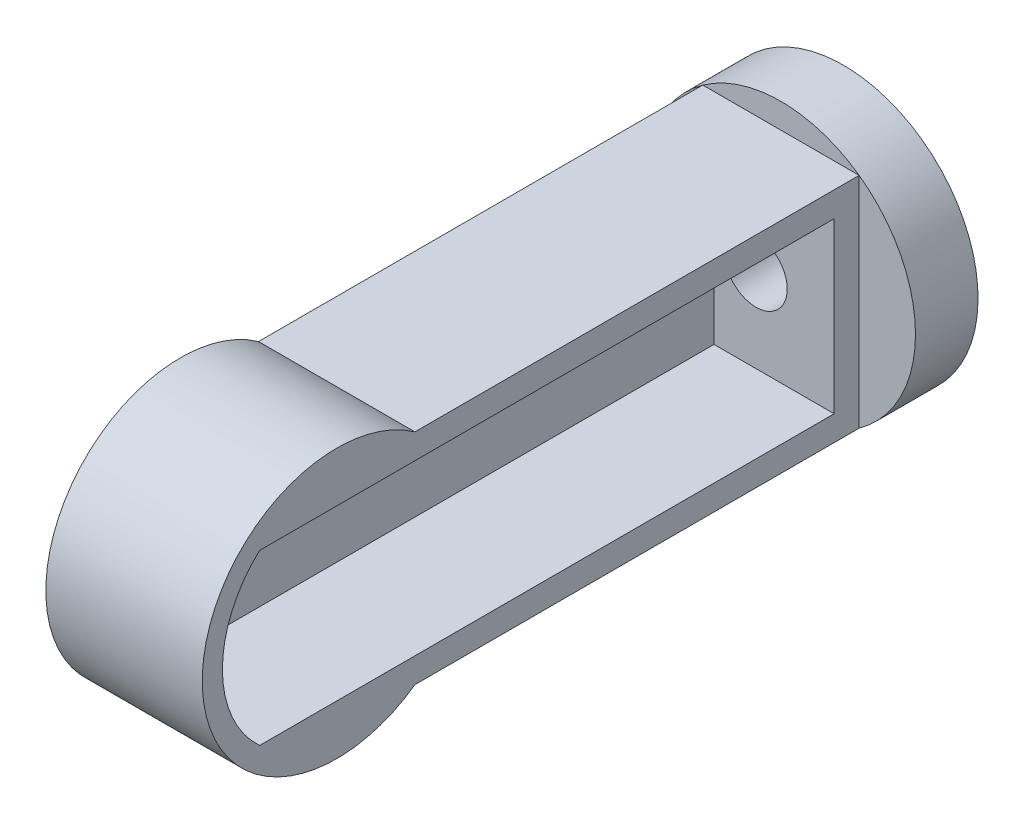
ISO-10303-21;
HEADER;
FILE_DESCRIPTION(('STEP AP214'),'2;1');
FILE_NAME('part.step','',(''),(''),'','','');
FILE_SCHEMA(('AUTOMOTIVE_DESIGN { 1 0 10303 214 1 1 1 1 }'));
ENDSEC;
DATA;
#1=APPLICATION_CONTEXT('core data for automotive mechanical design processes');
#2=APPLICATION_PROTOCOL_DEFINITION('international standard','automotive_design',2000,#1);
#3=PRODUCT_CONTEXT('',#1,'mechanical');
#4=PRODUCT('Part','Part','',(#3));
#5=PRODUCT_RELATED_PRODUCT_CATEGORY('part','',(#4));
#6=PRODUCT_DEFINITION_FORMATION('','',#4);
#7=PRODUCT_DEFINITION_CONTEXT('part definition',#1,'design');
#8=PRODUCT_DEFINITION('design','',#6,#7);
#9=PRODUCT_DEFINITION_SHAPE('','',#8);
#10=(LENGTH_UNIT() NAMED_UNIT(*) SI_UNIT(.MILLI.,.METRE.));
#11=(NAMED_UNIT(*) PLANE_ANGLE_UNIT() SI_UNIT($,.RADIAN.));
#12=(NAMED_UNIT(*) SI_UNIT($,.STERADIAN.) SOLID_ANGLE_UNIT());
#13=UNCERTAINTY_MEASURE_WITH_UNIT(LENGTH_MEASURE(1.E-05),#10,'distance_accuracy_value','');
#14=(GEOMETRIC_REPRESENTATION_CONTEXT(3) GLOBAL_UNCERTAINTY_ASSIGNED_CONTEXT((#13)) GLOBAL_UNIT_ASSIGNED_CONTEXT((#10,
#11,#12)) REPRESENTATION_CONTEXT('',''));
#15=CARTESIAN_POINT('',(0.,0.,0.));
#16=DIRECTION('',(0.,0.,1.));
#17=DIRECTION('',(1.,0.,0.));
#18=AXIS2_PLACEMENT_3D('',#15,#16,#17);
#19=CARTESIAN_POINT('',(12.5,0.,-59.4378440882945));
#20=DIRECTION('',(0.,0.,-1.));
#21=DIRECTION('',(-1.,0.,0.));
#22=AXIS2_PLACEMENT_3D('',#19,#20,#21);
#23=PLANE('',#22);
#24=CARTESIAN_POINT('',(0.,0.,-59.4378440882945));
#25=DIRECTION('',(0.,0.,-1.));
#26=DIRECTION('',(-1.,0.,0.));
#27=AXIS2_PLACEMENT_3D('',#24,#25,#26);
#28=CIRCLE('',#27,21.5);
#29=CARTESIAN_POINT('',(-12.5,17.4928556845359,-59.4378440882945));
#30=VERTEX_POINT('',#29);
#31=CARTESIAN_POINT('',(-12.4899959967968,17.5,-59.4378440882945));
#32=VERTEX_POINT('',#31);
#33=EDGE_CURVE('E161',#30,#32,#28,.T.);
#34=ORIENTED_EDGE('',*,*,#33,.F.);
#35=DIRECTION('',(0.,-1.,0.));
#36=VECTOR('',#35,1.);
#37=CARTESIAN_POINT('',(-12.5,0.,-59.4378440882945));
#38=LINE('',#37,#36);
#39=CARTESIAN_POINT('',(-12.5,17.5,-59.4378440882945));
#40=VERTEX_POINT('',#39);
#41=EDGE_CURVE('E144',#40,#30,#38,.T.);
#42=ORIENTED_EDGE('',*,*,#41,.F.);
#43=DIRECTION('',(-1.,0.,0.));
#44=VECTOR('',#43,1.);
#45=CARTESIAN_POINT('',(12.5,17.5,-59.4378440882945));
#46=LINE('',#45,#44);
#47=EDGE_CURVE('E283',#32,#40,#46,.T.);
#48=ORIENTED_EDGE('',*,*,#47,.F.);
#49=EDGE_LOOP('',(#34,#42,#48));
#50=FACE_BOUND('',#49,.T.);
#51=ADVANCED_FACE('F41',(#50),#23,.T.);
#52=CARTESIAN_POINT('',(12.4899959967968,17.5,-59.4378440882945));
#53=VERTEX_POINT('',#52);
#54=CARTESIAN_POINT('',(12.5,17.4928556845359,-59.4378440882945));
#55=VERTEX_POINT('',#54);
#56=EDGE_CURVE('E11',#53,#55,#28,.T.);
#57=ORIENTED_EDGE('',*,*,#56,.F.);
#58=CARTESIAN_POINT('',(12.5,17.5,-59.4378440882945));
#59=VERTEX_POINT('',#58);
#60=EDGE_CURVE('E284',#59,#53,#46,.T.);
#61=ORIENTED_EDGE('',*,*,#60,.F.);
#62=DIRECTION('',(0.,-1.,0.));
#63=VECTOR('',#62,1.);
#64=CARTESIAN_POINT('',(12.5,0.,-59.4378440882945));
#65=LINE('',#64,#63);
#66=EDGE_CURVE('E253',#59,#55,#65,.T.);
#67=ORIENTED_EDGE('',*,*,#66,.T.);
#68=EDGE_LOOP('',(#57,#61,#67));
#69=FACE_BOUND('',#68,.T.);
#70=ADVANCED_FACE('F215',(#69),#23,.T.);
#71=CARTESIAN_POINT('',(12.5,-17.4928556845359,-59.4378440882945));
#72=VERTEX_POINT('',#71);
#73=CARTESIAN_POINT('',(12.4899959967968,-17.5,-59.4378440882945));
#74=VERTEX_POINT('',#73);
#75=EDGE_CURVE('E51',#72,#74,#28,.T.);
#76=ORIENTED_EDGE('',*,*,#75,.F.);
#77=CARTESIAN_POINT('',(12.5,-17.5,-59.4378440882945));
#78=VERTEX_POINT('',#77);
#79=EDGE_CURVE('E242',#72,#78,#65,.T.);
#80=ORIENTED_EDGE('',*,*,#79,.T.);
#81=DIRECTION('',(-1.,0.,0.));
#82=VECTOR('',#81,1.);
#83=CARTESIAN_POINT('',(12.5,-17.5,-59.4378440882945));
#84=LINE('',#83,#82);
#85=EDGE_CURVE('E170',#78,#74,#84,.T.);
#86=ORIENTED_EDGE('',*,*,#85,.T.);
#87=EDGE_LOOP('',(#76,#80,#86));
#88=FACE_BOUND('',#87,.T.);
#89=ADVANCED_FACE('F221',(#88),#23,.T.);
#90=CARTESIAN_POINT('',(12.5,0.,24.0621559117055));
#91=DIRECTION('',(-1.,0.,0.));
#92=DIRECTION('',(0.,0.,1.));
#93=AXIS2_PLACEMENT_3D('',#90,#91,#92);
#94=CYLINDRICAL_SURFACE('',#93,5.);
#95=CARTESIAN_POINT('',(-12.5,0.,24.0621559117055));
#96=DIRECTION('',(1.,0.,0.));
#97=DIRECTION('',(0.,0.,-1.));
#98=AXIS2_PLACEMENT_3D('',#95,#96,#97);
#99=CIRCLE('',#98,5.);
#100=CARTESIAN_POINT('',(-12.5,0.,19.0621559117055));
#101=VERTEX_POINT('',#100);
#102=EDGE_CURVE('E265',#101,#101,#99,.T.);
#103=ORIENTED_EDGE('',*,*,#102,.F.);
#104=EDGE_LOOP('',(#103));
#105=FACE_BOUND('',#104,.T.);
#106=CARTESIAN_POINT('',(-6.7,0.,24.0621559117055));
#107=DIRECTION('',(1.,0.,0.));
#108=DIRECTION('',(0.,0.,-1.));
#109=AXIS2_PLACEMENT_3D('',#106,#107,#108);
#110=CIRCLE('',#109,5.);
#111=CARTESIAN_POINT('',(-6.7,0.,19.0621559117055));
#112=VERTEX_POINT('',#111);
#113=EDGE_CURVE('E308',#112,#112,#110,.F.);
#114=ORIENTED_EDGE('',*,*,#113,.F.);
#115=EDGE_LOOP('',(#114));
#116=FACE_BOUND('',#115,.T.);
#117=ADVANCED_FACE('F43',(#105,#116),#94,.F.);
#118=CARTESIAN_POINT('',(12.5,0.,24.0621559117055));
#119=DIRECTION('',(-1.,0.,0.));
#120=DIRECTION('',(0.,0.,1.));
#121=AXIS2_PLACEMENT_3D('',#118,#119,#120);
#122=CYLINDRICAL_SURFACE('',#121,21.5);
#123=CARTESIAN_POINT('',(-12.5,0.,24.0621559117055));
#124=DIRECTION('',(1.,0.,0.));
#125=DIRECTION('',(0.,0.,-1.));
#126=AXIS2_PLACEMENT_3D('',#123,#124,#125);
#127=CIRCLE('',#126,21.5);
#128=CARTESIAN_POINT('',(-12.5,17.5,11.5721599149088));
#129=VERTEX_POINT('',#128);
#130=CARTESIAN_POINT('',(-12.5,-17.5,11.5721599149088));
#131=VERTEX_POINT('',#130);
#132=EDGE_CURVE('E269',#129,#131,#127,.T.);
#133=ORIENTED_EDGE('',*,*,#132,.T.);
#134=DIRECTION('',(-1.,0.,0.));
#135=VECTOR('',#134,1.);
#136=CARTESIAN_POINT('',(12.5,-17.5,11.5721599149088));
#137=LINE('',#136,#135);
#138=CARTESIAN_POINT('',(12.5,-17.5,11.5721599149088));
#139=VERTEX_POINT('',#138);
#140=EDGE_CURVE('E45',#139,#131,#137,.T.);
#141=ORIENTED_EDGE('',*,*,#140,.F.);
#142=CARTESIAN_POINT('',(12.5,0.,24.0621559117055));
#143=DIRECTION('',(1.,0.,0.));
#144=DIRECTION('',(0.,0.,-1.));
#145=AXIS2_PLACEMENT_3D('',#142,#143,#144);
#146=CIRCLE('',#145,21.5);
#147=CARTESIAN_POINT('',(12.5,17.5,11.5721599149088));
#148=VERTEX_POINT('',#147);
#149=EDGE_CURVE('E280',#148,#139,#146,.T.);
#150=ORIENTED_EDGE('',*,*,#149,.F.);
#151=DIRECTION('',(-1.,0.,0.));
#152=VECTOR('',#151,1.);
#153=CARTESIAN_POINT('',(12.5,17.5,11.5721599149088));
#154=LINE('',#153,#152);
#155=EDGE_CURVE('E264',#148,#129,#154,.T.);
#156=ORIENTED_EDGE('',*,*,#155,.T.);
#157=EDGE_LOOP('',(#133,#141,#150,#156));
#158=FACE_BOUND('',#157,.T.);
#159=ADVANCED_FACE('F234',(#158),#122,.T.);
#160=CARTESIAN_POINT('',(12.5,-17.5,0.));
#161=DIRECTION('',(0.,1.,0.));
#162=DIRECTION('',(0.,0.,1.));
#163=AXIS2_PLACEMENT_3D('',#160,#161,#162);
#164=PLANE('',#163);
#165=DIRECTION('',(0.,0.,-1.));
#166=VECTOR('',#165,1.);
#167=CARTESIAN_POINT('',(-12.5,-17.5,0.));
#168=LINE('',#167,#166);
#169=CARTESIAN_POINT('',(-12.5,-17.5,-59.4378440882945));
#170=VERTEX_POINT('',#169);
#171=EDGE_CURVE('E153',#131,#170,#168,.T.);
#172=ORIENTED_EDGE('',*,*,#171,.T.);
#173=CARTESIAN_POINT('',(-12.4899959967968,-17.5,-59.4378440882945));
#174=VERTEX_POINT('',#173);
#175=EDGE_CURVE('E151',#174,#170,#84,.T.);
#176=ORIENTED_EDGE('',*,*,#175,.F.);
#177=EDGE_CURVE('E67',#74,#174,#84,.T.);
#178=ORIENTED_EDGE('',*,*,#177,.F.);
#179=ORIENTED_EDGE('',*,*,#85,.F.);
#180=DIRECTION('',(0.,0.,-1.));
#181=VECTOR('',#180,1.);
#182=CARTESIAN_POINT('',(12.5,-17.5,0.));
#183=LINE('',#182,#181);
#184=EDGE_CURVE('E250',#139,#78,#183,.T.);
#185=ORIENTED_EDGE('',*,*,#184,.F.);
#186=ORIENTED_EDGE('',*,*,#140,.T.);
#187=EDGE_LOOP('',(#172,#176,#178,#179,#185,#186));
#188=FACE_BOUND('',#187,.T.);
#189=ADVANCED_FACE('F227',(#188),#164,.F.);
#190=CARTESIAN_POINT('',(-12.5,-17.4928556845359,-59.4378440882945));
#191=VERTEX_POINT('',#190);
#192=EDGE_CURVE('E60',#174,#191,#28,.T.);
#193=ORIENTED_EDGE('',*,*,#192,.F.);
#194=ORIENTED_EDGE('',*,*,#175,.T.);
#195=EDGE_CURVE('E140',#191,#170,#38,.T.);
#196=ORIENTED_EDGE('',*,*,#195,.F.);
#197=EDGE_LOOP('',(#193,#194,#196));
#198=FACE_BOUND('',#197,.T.);
#199=ADVANCED_FACE('F150',(#198),#23,.T.);
#200=CARTESIAN_POINT('',(12.5,17.5,0.));
#201=DIRECTION('',(0.,1.,0.));
#202=DIRECTION('',(0.,0.,1.));
#203=AXIS2_PLACEMENT_3D('',#200,#201,#202);
#204=PLANE('',#203);
#205=DIRECTION('',(0.,0.,-1.));
#206=VECTOR('',#205,1.);
#207=CARTESIAN_POINT('',(-12.5,17.5,0.));
#208=LINE('',#207,#206);
#209=EDGE_CURVE('E277',#129,#40,#208,.T.);
#210=ORIENTED_EDGE('',*,*,#209,.F.);
#211=ORIENTED_EDGE('',*,*,#155,.F.);
#212=DIRECTION('',(0.,0.,-1.));
#213=VECTOR('',#212,1.);
#214=CARTESIAN_POINT('',(12.5,17.5,0.));
#215=LINE('',#214,#213);
#216=EDGE_CURVE('E257',#148,#59,#215,.T.);
#217=ORIENTED_EDGE('',*,*,#216,.T.);
#218=ORIENTED_EDGE('',*,*,#60,.T.);
#219=EDGE_CURVE('E287',#53,#32,#46,.T.);
#220=ORIENTED_EDGE('',*,*,#219,.T.);
#221=ORIENTED_EDGE('',*,*,#47,.T.);
#222=EDGE_LOOP('',(#210,#211,#217,#218,#220,#221));
#223=FACE_BOUND('',#222,.T.);
#224=ADVANCED_FACE('F226',(#223),#204,.T.);
#225=CARTESIAN_POINT('',(12.5,0.,0.));
#226=DIRECTION('',(1.,0.,0.));
#227=DIRECTION('',(0.,0.,-1.));
#228=AXIS2_PLACEMENT_3D('',#225,#226,#227);
#229=PLANE('',#228);
#230=DIRECTION('',(0.,0.,1.));
#231=VECTOR('',#230,1.);
#232=CARTESIAN_POINT('',(12.5,13.5,0.));
#233=LINE('',#232,#231);
#234=CARTESIAN_POINT('',(12.5,13.5,-55.4378440882945));
#235=VERTEX_POINT('',#234);
#236=CARTESIAN_POINT('',(12.5,13.5,36.3845443586126));
#237=VERTEX_POINT('',#236);
#238=EDGE_CURVE('E179',#235,#237,#233,.T.);
#239=ORIENTED_EDGE('',*,*,#238,.F.);
#240=DIRECTION('',(0.,-1.,0.));
#241=VECTOR('',#240,1.);
#242=CARTESIAN_POINT('',(12.5,0.,-55.4378440882945));
#243=LINE('',#242,#241);
#244=CARTESIAN_POINT('',(12.5,-13.5,-55.4378440882945));
#245=VERTEX_POINT('',#244);
#246=EDGE_CURVE('E316',#235,#245,#243,.T.);
#247=ORIENTED_EDGE('',*,*,#246,.T.);
#248=DIRECTION('',(0.,0.,1.));
#249=VECTOR('',#248,1.);
#250=CARTESIAN_POINT('',(12.5,-13.5,0.));
#251=LINE('',#250,#249);
#252=CARTESIAN_POINT('',(12.5,-13.5,36.3845443586126));
#253=VERTEX_POINT('',#252);
#254=EDGE_CURVE('E321',#245,#253,#251,.T.);
#255=ORIENTED_EDGE('',*,*,#254,.T.);
#256=CARTESIAN_POINT('',(12.5,0.,24.0621559117055));
#257=DIRECTION('',(1.,0.,0.));
#258=DIRECTION('',(0.,0.,-1.));
#259=AXIS2_PLACEMENT_3D('',#256,#257,#258);
#260=CIRCLE('',#259,18.2781633934176);
#261=EDGE_CURVE('E325',#237,#253,#260,.T.);
#262=ORIENTED_EDGE('',*,*,#261,.F.);
#263=EDGE_LOOP('',(#239,#247,#255,#262));
#264=FACE_BOUND('',#263,.T.);
#265=ORIENTED_EDGE('',*,*,#149,.T.);
#266=ORIENTED_EDGE('',*,*,#184,.T.);
#267=ORIENTED_EDGE('',*,*,#79,.F.);
#268=EDGE_CURVE('E248',#55,#72,#65,.T.);
#269=ORIENTED_EDGE('',*,*,#268,.F.);
#270=ORIENTED_EDGE('',*,*,#66,.F.);
#271=ORIENTED_EDGE('',*,*,#216,.F.);
#272=EDGE_LOOP('',(#265,#266,#267,#269,#270,#271));
#273=FACE_BOUND('',#272,.T.);
#274=ADVANCED_FACE('F232',(#264,#273),#229,.T.);
#275=CARTESIAN_POINT('',(-12.5,0.,0.));
#276=DIRECTION('',(1.,0.,0.));
#277=DIRECTION('',(0.,0.,-1.));
#278=AXIS2_PLACEMENT_3D('',#275,#276,#277);
#279=PLANE('',#278);
#280=ORIENTED_EDGE('',*,*,#102,.T.);
#281=EDGE_LOOP('',(#280));
#282=FACE_BOUND('',#281,.T.);
#283=ORIENTED_EDGE('',*,*,#132,.F.);
#284=ORIENTED_EDGE('',*,*,#209,.T.);
#285=ORIENTED_EDGE('',*,*,#41,.T.);
#286=EDGE_CURVE('E137',#30,#191,#38,.T.);
#287=ORIENTED_EDGE('',*,*,#286,.T.);
#288=ORIENTED_EDGE('',*,*,#195,.T.);
#289=ORIENTED_EDGE('',*,*,#171,.F.);
#290=EDGE_LOOP('',(#283,#284,#285,#287,#288,#289));
#291=FACE_BOUND('',#290,.T.);
#292=ADVANCED_FACE('F139',(#282,#291),#279,.F.);
#293=CARTESIAN_POINT('',(-6.7,13.5,0.));
#294=DIRECTION('',(0.,1.,0.));
#295=DIRECTION('',(0.,0.,1.));
#296=AXIS2_PLACEMENT_3D('',#293,#294,#295);
#297=PLANE('',#296);
#298=ORIENTED_EDGE('',*,*,#238,.T.);
#299=DIRECTION('',(1.,0.,0.));
#300=VECTOR('',#299,1.);
#301=CARTESIAN_POINT('',(-6.7,13.5,36.3845443586126));
#302=LINE('',#301,#300);
#303=CARTESIAN_POINT('',(-6.7,13.5,36.3845443586126));
#304=VERTEX_POINT('',#303);
#305=EDGE_CURVE('E303',#304,#237,#302,.T.);
#306=ORIENTED_EDGE('',*,*,#305,.F.);
#307=DIRECTION('',(0.,0.,1.));
#308=VECTOR('',#307,1.);
#309=CARTESIAN_POINT('',(-6.7,13.5,0.));
#310=LINE('',#309,#308);
#311=CARTESIAN_POINT('',(-6.7,13.5,-55.4378440882945));
#312=VERTEX_POINT('',#311);
#313=EDGE_CURVE('E320',#312,#304,#310,.T.);
#314=ORIENTED_EDGE('',*,*,#313,.F.);
#315=DIRECTION('',(1.,0.,0.));
#316=VECTOR('',#315,1.);
#317=CARTESIAN_POINT('',(-6.7,13.5,-55.4378440882945));
#318=LINE('',#317,#316);
#319=EDGE_CURVE('E270',#312,#235,#318,.T.);
#320=ORIENTED_EDGE('',*,*,#319,.T.);
#321=EDGE_LOOP('',(#298,#306,#314,#320));
#322=FACE_BOUND('',#321,.T.);
#323=ADVANCED_FACE('F353',(#322),#297,.F.);
#324=CARTESIAN_POINT('',(-6.7,0.,-55.4378440882945));
#325=DIRECTION('',(0.,0.,1.));
#326=DIRECTION('',(1.,0.,0.));
#327=AXIS2_PLACEMENT_3D('',#324,#325,#326);
#328=PLANE('',#327);
#329=CARTESIAN_POINT('',(0.,0.,-55.4378440882945));
#330=DIRECTION('',(0.,0.,1.));
#331=DIRECTION('',(1.,0.,0.));
#332=AXIS2_PLACEMENT_3D('',#329,#330,#331);
#333=CIRCLE('',#332,5.);
#334=CARTESIAN_POINT('',(5.,0.,-55.4378440882945));
#335=VERTEX_POINT('',#334);
#336=EDGE_CURVE('E160',#335,#335,#333,.T.);
#337=ORIENTED_EDGE('',*,*,#336,.F.);
#338=EDGE_LOOP('',(#337));
#339=FACE_BOUND('',#338,.T.);
#340=ORIENTED_EDGE('',*,*,#246,.F.);
#341=ORIENTED_EDGE('',*,*,#319,.F.);
#342=DIRECTION('',(0.,-1.,0.));
#343=VECTOR('',#342,1.);
#344=CARTESIAN_POINT('',(-6.7,0.,-55.4378440882945));
#345=LINE('',#344,#343);
#346=CARTESIAN_POINT('',(-6.7,-13.5,-55.4378440882945));
#347=VERTEX_POINT('',#346);
#348=EDGE_CURVE('E334',#312,#347,#345,.T.);
#349=ORIENTED_EDGE('',*,*,#348,.T.);
#350=DIRECTION('',(1.,0.,0.));
#351=VECTOR('',#350,1.);
#352=CARTESIAN_POINT('',(-6.7,-13.5,-55.4378440882945));
#353=LINE('',#352,#351);
#354=EDGE_CURVE('E311',#347,#245,#353,.T.);
#355=ORIENTED_EDGE('',*,*,#354,.T.);
#356=EDGE_LOOP('',(#340,#341,#349,#355));
#357=FACE_BOUND('',#356,.T.);
#358=ADVANCED_FACE('F365',(#339,#357),#328,.T.);
#359=CARTESIAN_POINT('',(-6.7,-13.5,0.));
#360=DIRECTION('',(0.,1.,0.));
#361=DIRECTION('',(0.,0.,1.));
#362=AXIS2_PLACEMENT_3D('',#359,#360,#361);
#363=PLANE('',#362);
#364=ORIENTED_EDGE('',*,*,#254,.F.);
#365=ORIENTED_EDGE('',*,*,#354,.F.);
#366=DIRECTION('',(0.,0.,1.));
#367=VECTOR('',#366,1.);
#368=CARTESIAN_POINT('',(-6.7,-13.5,0.));
#369=LINE('',#368,#367);
#370=CARTESIAN_POINT('',(-6.7,-13.5,36.3845443586126));
#371=VERTEX_POINT('',#370);
#372=EDGE_CURVE('E337',#347,#371,#369,.T.);
#373=ORIENTED_EDGE('',*,*,#372,.T.);
#374=DIRECTION('',(1.,0.,0.));
#375=VECTOR('',#374,1.);
#376=CARTESIAN_POINT('',(-6.7,-13.5,36.3845443586126));
#377=LINE('',#376,#375);
#378=EDGE_CURVE('E307',#371,#253,#377,.T.);
#379=ORIENTED_EDGE('',*,*,#378,.T.);
#380=EDGE_LOOP('',(#364,#365,#373,#379));
#381=FACE_BOUND('',#380,.T.);
#382=ADVANCED_FACE('F362',(#381),#363,.T.);
#383=CARTESIAN_POINT('',(-6.7,0.,24.0621559117055));
#384=DIRECTION('',(1.,0.,0.));
#385=DIRECTION('',(0.,0.,-1.));
#386=AXIS2_PLACEMENT_3D('',#383,#384,#385);
#387=CYLINDRICAL_SURFACE('',#386,18.2781633934176);
#388=ORIENTED_EDGE('',*,*,#261,.T.);
#389=ORIENTED_EDGE('',*,*,#378,.F.);
#390=CARTESIAN_POINT('',(-6.7,0.,24.0621559117055));
#391=DIRECTION('',(1.,0.,0.));
#392=DIRECTION('',(0.,0.,-1.));
#393=AXIS2_PLACEMENT_3D('',#390,#391,#392);
#394=CIRCLE('',#393,18.2781633934176);
#395=EDGE_CURVE('E340',#304,#371,#394,.T.);
#396=ORIENTED_EDGE('',*,*,#395,.F.);
#397=ORIENTED_EDGE('',*,*,#305,.T.);
#398=EDGE_LOOP('',(#388,#389,#396,#397));
#399=FACE_BOUND('',#398,.T.);
#400=ADVANCED_FACE('F359',(#399),#387,.F.);
#401=CARTESIAN_POINT('',(-6.7,0.,0.));
#402=DIRECTION('',(1.,0.,0.));
#403=DIRECTION('',(0.,0.,-1.));
#404=AXIS2_PLACEMENT_3D('',#401,#402,#403);
#405=PLANE('',#404);
#406=ORIENTED_EDGE('',*,*,#313,.T.);
#407=ORIENTED_EDGE('',*,*,#395,.T.);
#408=ORIENTED_EDGE('',*,*,#372,.F.);
#409=ORIENTED_EDGE('',*,*,#348,.F.);
#410=EDGE_LOOP('',(#406,#407,#408,#409));
#411=FACE_BOUND('',#410,.T.);
#412=ORIENTED_EDGE('',*,*,#113,.T.);
#413=EDGE_LOOP('',(#412));
#414=FACE_BOUND('',#413,.T.);
#415=ADVANCED_FACE('F348',(#411,#414),#405,.T.);
#416=CARTESIAN_POINT('',(0.,0.,-59.4378440882945));
#417=DIRECTION('',(0.,0.,-1.));
#418=DIRECTION('',(-1.,0.,0.));
#419=AXIS2_PLACEMENT_3D('',#416,#417,#418);
#420=PLANE('',#419);
#421=ORIENTED_EDGE('',*,*,#286,.F.);
#422=EDGE_CURVE('E154',#191,#30,#28,.T.);
#423=ORIENTED_EDGE('',*,*,#422,.F.);
#424=EDGE_LOOP('',(#421,#423));
#425=FACE_BOUND('',#424,.T.);
#426=ADVANCED_FACE('F155',(#425),#420,.F.);
#427=EDGE_CURVE('E180',#55,#72,#28,.T.);
#428=ORIENTED_EDGE('',*,*,#427,.F.);
#429=ORIENTED_EDGE('',*,*,#268,.T.);
#430=EDGE_LOOP('',(#428,#429));
#431=FACE_BOUND('',#430,.T.);
#432=ADVANCED_FACE('F210',(#431),#420,.F.);
#433=EDGE_CURVE('E159',#74,#174,#28,.T.);
#434=ORIENTED_EDGE('',*,*,#433,.F.);
#435=ORIENTED_EDGE('',*,*,#177,.T.);
#436=EDGE_LOOP('',(#434,#435));
#437=FACE_BOUND('',#436,.T.);
#438=ADVANCED_FACE('F205',(#437),#420,.F.);
#439=CARTESIAN_POINT('',(0.,0.,-69.4378440882945));
#440=DIRECTION('',(0.,0.,1.));
#441=DIRECTION('',(1.,0.,0.));
#442=AXIS2_PLACEMENT_3D('',#439,#440,#441);
#443=CYLINDRICAL_SURFACE('',#442,21.5);
#444=CARTESIAN_POINT('',(0.,0.,-69.4378440882945));
#445=DIRECTION('',(0.,0.,-1.));
#446=DIRECTION('',(-1.,0.,0.));
#447=AXIS2_PLACEMENT_3D('',#444,#445,#446);
#448=CIRCLE('',#447,21.5);
#449=CARTESIAN_POINT('',(-21.5,0.,-69.4378440882945));
#450=VERTEX_POINT('',#449);
#451=EDGE_CURVE('E174',#450,#450,#448,.T.);
#452=ORIENTED_EDGE('',*,*,#451,.F.);
#453=EDGE_LOOP('',(#452));
#454=FACE_BOUND('',#453,.T.);
#455=ORIENTED_EDGE('',*,*,#33,.T.);
#456=EDGE_CURVE('E53',#32,#53,#28,.T.);
#457=ORIENTED_EDGE('',*,*,#456,.T.);
#458=ORIENTED_EDGE('',*,*,#56,.T.);
#459=ORIENTED_EDGE('',*,*,#427,.T.);
#460=ORIENTED_EDGE('',*,*,#75,.T.);
#461=ORIENTED_EDGE('',*,*,#433,.T.);
#462=ORIENTED_EDGE('',*,*,#192,.T.);
#463=ORIENTED_EDGE('',*,*,#422,.T.);
#464=EDGE_LOOP('',(#455,#457,#458,#459,#460,#461,#462,#463));
#465=FACE_BOUND('',#464,.T.);
#466=ADVANCED_FACE('F163',(#454,#465),#443,.T.);
#467=CARTESIAN_POINT('',(0.,0.,-69.4378440882945));
#468=DIRECTION('',(0.,0.,-1.));
#469=DIRECTION('',(-1.,0.,0.));
#470=AXIS2_PLACEMENT_3D('',#467,#468,#469);
#471=PLANE('',#470);
#472=CARTESIAN_POINT('',(0.,0.,-69.4378440882945));
#473=DIRECTION('',(0.,0.,-1.));
#474=DIRECTION('',(-1.,0.,0.));
#475=AXIS2_PLACEMENT_3D('',#472,#473,#474);
#476=CIRCLE('',#475,5.);
#477=CARTESIAN_POINT('',(-5.,0.,-69.4378440882945));
#478=VERTEX_POINT('',#477);
#479=EDGE_CURVE('E189',#478,#478,#476,.T.);
#480=ORIENTED_EDGE('',*,*,#479,.F.);
#481=EDGE_LOOP('',(#480));
#482=FACE_BOUND('',#481,.T.);
#483=ORIENTED_EDGE('',*,*,#451,.T.);
#484=EDGE_LOOP('',(#483));
#485=FACE_BOUND('',#484,.T.);
#486=ADVANCED_FACE('F197',(#482,#485),#471,.T.);
#487=ORIENTED_EDGE('',*,*,#219,.F.);
#488=ORIENTED_EDGE('',*,*,#456,.F.);
#489=EDGE_LOOP('',(#487,#488));
#490=FACE_BOUND('',#489,.T.);
#491=ADVANCED_FACE('F200',(#490),#420,.F.);
#492=CARTESIAN_POINT('',(0.,0.,-50.4378440882944));
#493=DIRECTION('',(0.,0.,-1.));
#494=DIRECTION('',(-1.,0.,0.));
#495=AXIS2_PLACEMENT_3D('',#492,#493,#494);
#496=CYLINDRICAL_SURFACE('',#495,5.);
#497=ORIENTED_EDGE('',*,*,#336,.T.);
#498=EDGE_LOOP('',(#497));
#499=FACE_BOUND('',#498,.T.);
#500=ORIENTED_EDGE('',*,*,#479,.T.);
#501=EDGE_LOOP('',(#500));
#502=FACE_BOUND('',#501,.T.);
#503=ADVANCED_FACE('F195',(#499,#502),#496,.F.);
#504=CLOSED_SHELL('',(#51,#70,#89,#117,#159,#189,#199,#224,#274,#292,#323,#358,#382,#400,#415,
#426,#432,#438,#466,#486,#491,#503));
#505=MANIFOLD_SOLID_BREP('B2',#504);
#506=ADVANCED_BREP_SHAPE_REPRESENTATION('',(#18,#505),#14);
#507=SHAPE_DEFINITION_REPRESENTATION(#9,#506);
ENDSEC;
END-ISO-10303-21;
